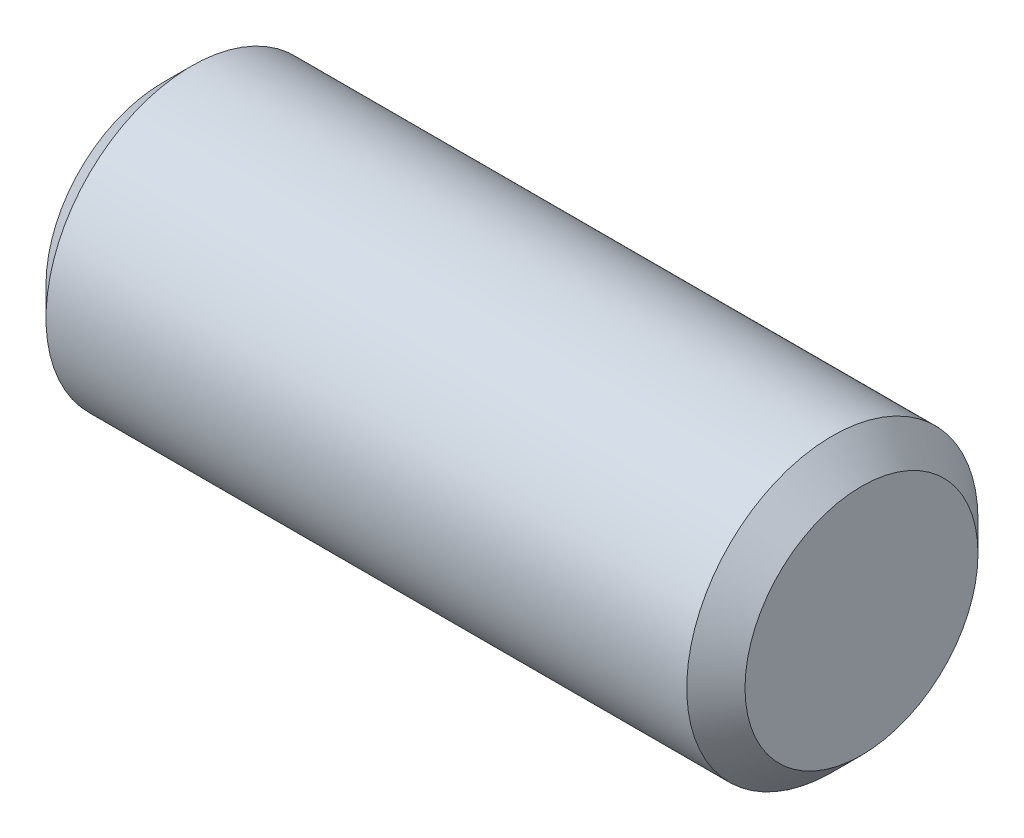
ISO-10303-21;
HEADER;
FILE_DESCRIPTION(('STEP AP214'),'2;1');
FILE_NAME('part.step','',(''),(''),'','','');
FILE_SCHEMA(('AUTOMOTIVE_DESIGN { 1 0 10303 214 1 1 1 1 }'));
ENDSEC;
DATA;
#1=APPLICATION_CONTEXT('core data for automotive mechanical design processes');
#2=APPLICATION_PROTOCOL_DEFINITION('international standard','automotive_design',2000,#1);
#3=PRODUCT_CONTEXT('',#1,'mechanical');
#4=PRODUCT('Part','Part','',(#3));
#5=PRODUCT_RELATED_PRODUCT_CATEGORY('part','',(#4));
#6=PRODUCT_DEFINITION_FORMATION('','',#4);
#7=PRODUCT_DEFINITION_CONTEXT('part definition',#1,'design');
#8=PRODUCT_DEFINITION('design','',#6,#7);
#9=PRODUCT_DEFINITION_SHAPE('','',#8);
#10=(LENGTH_UNIT() NAMED_UNIT(*) SI_UNIT(.MILLI.,.METRE.));
#11=(NAMED_UNIT(*) PLANE_ANGLE_UNIT() SI_UNIT($,.RADIAN.));
#12=(NAMED_UNIT(*) SI_UNIT($,.STERADIAN.) SOLID_ANGLE_UNIT());
#13=UNCERTAINTY_MEASURE_WITH_UNIT(LENGTH_MEASURE(1.E-05),#10,'distance_accuracy_value','');
#14=(GEOMETRIC_REPRESENTATION_CONTEXT(3) GLOBAL_UNCERTAINTY_ASSIGNED_CONTEXT((#13)) GLOBAL_UNIT_ASSIGNED_CONTEXT((#10,
#11,#12)) REPRESENTATION_CONTEXT('',''));
#15=CARTESIAN_POINT('',(0.,0.,0.));
#16=DIRECTION('',(0.,0.,1.));
#17=DIRECTION('',(1.,0.,0.));
#18=AXIS2_PLACEMENT_3D('',#15,#16,#17);
#19=CARTESIAN_POINT('',(-6.,0.,0.));
#20=DIRECTION('',(1.,0.,0.));
#21=DIRECTION('',(0.,0.,-1.));
#22=AXIS2_PLACEMENT_3D('',#19,#20,#21);
#23=CYLINDRICAL_SURFACE('',#22,2.5);
#24=CARTESIAN_POINT('',(-5.5,0.,0.));
#25=DIRECTION('',(1.,0.,0.));
#26=DIRECTION('',(0.,0.,-1.));
#27=AXIS2_PLACEMENT_3D('',#24,#25,#26);
#28=CIRCLE('',#27,2.5);
#29=CARTESIAN_POINT('',(-5.5,0.,-2.5));
#30=VERTEX_POINT('',#29);
#31=EDGE_CURVE('E41',#30,#30,#28,.T.);
#32=ORIENTED_EDGE('',*,*,#31,.T.);
#33=EDGE_LOOP('',(#32));
#34=FACE_BOUND('',#33,.T.);
#35=CARTESIAN_POINT('',(5.5,0.,0.));
#36=DIRECTION('',(1.,0.,0.));
#37=DIRECTION('',(0.,0.,-1.));
#38=AXIS2_PLACEMENT_3D('',#35,#36,#37);
#39=CIRCLE('',#38,2.5);
#40=CARTESIAN_POINT('',(5.5,0.,-2.5));
#41=VERTEX_POINT('',#40);
#42=EDGE_CURVE('E45',#41,#41,#39,.F.);
#43=ORIENTED_EDGE('',*,*,#42,.T.);
#44=EDGE_LOOP('',(#43));
#45=FACE_BOUND('',#44,.T.);
#46=ADVANCED_FACE('F30',(#34,#45),#23,.T.);
#47=CARTESIAN_POINT('',(-6.,0.,0.));
#48=DIRECTION('',(1.,0.,0.));
#49=DIRECTION('',(0.,0.,-1.));
#50=AXIS2_PLACEMENT_3D('',#47,#48,#49);
#51=PLANE('',#50);
#52=CARTESIAN_POINT('',(-6.,0.,0.));
#53=DIRECTION('',(1.,0.,0.));
#54=DIRECTION('',(0.,0.,-1.));
#55=AXIS2_PLACEMENT_3D('',#52,#53,#54);
#56=CIRCLE('',#55,2.);
#57=CARTESIAN_POINT('',(-6.,0.,-2.));
#58=VERTEX_POINT('',#57);
#59=EDGE_CURVE('E37',#58,#58,#56,.F.);
#60=ORIENTED_EDGE('',*,*,#59,.T.);
#61=EDGE_LOOP('',(#60));
#62=FACE_BOUND('',#61,.T.);
#63=ADVANCED_FACE('F61',(#62),#51,.F.);
#64=CARTESIAN_POINT('',(6.,0.,0.));
#65=DIRECTION('',(1.,0.,0.));
#66=DIRECTION('',(0.,0.,-1.));
#67=AXIS2_PLACEMENT_3D('',#64,#65,#66);
#68=PLANE('',#67);
#69=CARTESIAN_POINT('',(6.,0.,0.));
#70=DIRECTION('',(1.,0.,0.));
#71=DIRECTION('',(0.,0.,-1.));
#72=AXIS2_PLACEMENT_3D('',#69,#70,#71);
#73=CIRCLE('',#72,2.);
#74=CARTESIAN_POINT('',(6.,0.,-2.));
#75=VERTEX_POINT('',#74);
#76=EDGE_CURVE('E10',#75,#75,#73,.T.);
#77=ORIENTED_EDGE('',*,*,#76,.T.);
#78=EDGE_LOOP('',(#77));
#79=FACE_BOUND('',#78,.T.);
#80=ADVANCED_FACE('F58',(#79),#68,.T.);
#81=CARTESIAN_POINT('',(-5.5,0.,0.));
#82=DIRECTION('',(1.,0.,0.));
#83=DIRECTION('',(0.,0.,-1.));
#84=AXIS2_PLACEMENT_3D('',#81,#82,#83);
#85=CONICAL_SURFACE('',#84,2.5,0.785398163397451);
#86=ORIENTED_EDGE('',*,*,#59,.F.);
#87=EDGE_LOOP('',(#86));
#88=FACE_BOUND('',#87,.T.);
#89=ORIENTED_EDGE('',*,*,#31,.F.);
#90=EDGE_LOOP('',(#89));
#91=FACE_BOUND('',#90,.T.);
#92=ADVANCED_FACE('F54',(#88,#91),#85,.T.);
#93=CARTESIAN_POINT('',(6.,0.,0.));
#94=DIRECTION('',(-1.,0.,0.));
#95=DIRECTION('',(0.,0.,1.));
#96=AXIS2_PLACEMENT_3D('',#93,#94,#95);
#97=CONICAL_SURFACE('',#96,2.,0.785398163397444);
#98=ORIENTED_EDGE('',*,*,#42,.F.);
#99=EDGE_LOOP('',(#98));
#100=FACE_BOUND('',#99,.T.);
#101=ORIENTED_EDGE('',*,*,#76,.F.);
#102=EDGE_LOOP('',(#101));
#103=FACE_BOUND('',#102,.T.);
#104=ADVANCED_FACE('F32',(#100,#103),#97,.T.);
#105=CLOSED_SHELL('',(#46,#63,#80,#92,#104));
#106=MANIFOLD_SOLID_BREP('B2',#105);
#107=ADVANCED_BREP_SHAPE_REPRESENTATION('',(#18,#106),#14);
#108=SHAPE_DEFINITION_REPRESENTATION(#9,#107);
ENDSEC;
END-ISO-10303-21;
